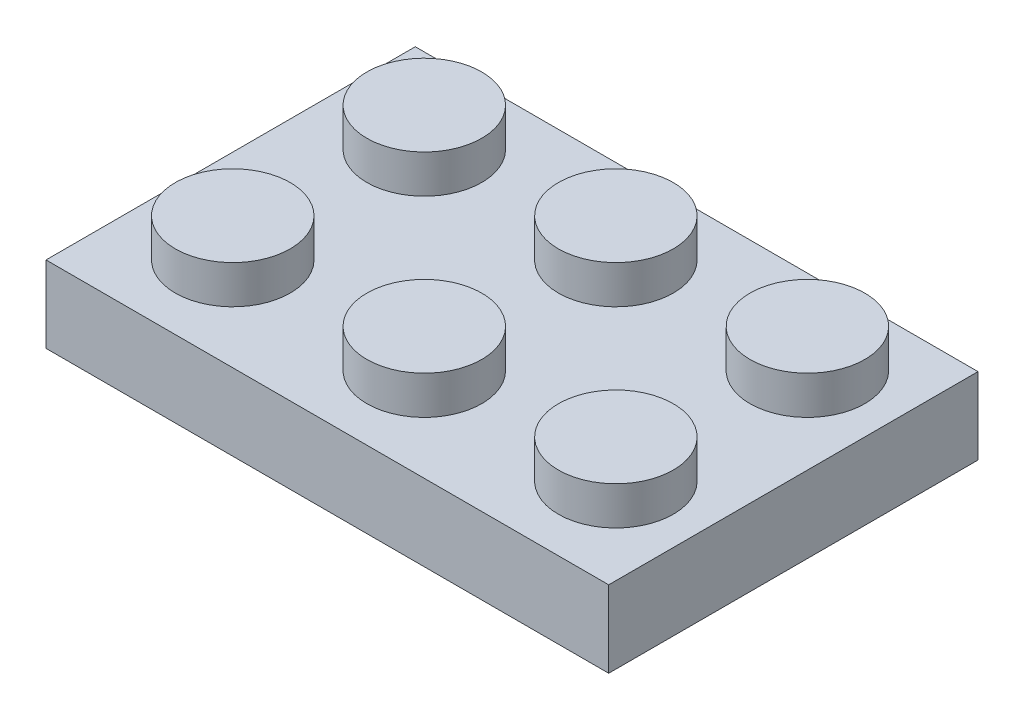
ISO-10303-21;
HEADER;
FILE_DESCRIPTION(('STEP AP214'),'2;1');
FILE_NAME('part.step','',(''),(''),'','','');
FILE_SCHEMA(('AUTOMOTIVE_DESIGN { 1 0 10303 214 1 1 1 1 }'));
ENDSEC;
DATA;
#1=APPLICATION_CONTEXT('core data for automotive mechanical design processes');
#2=APPLICATION_PROTOCOL_DEFINITION('international standard','automotive_design',2000,#1);
#3=PRODUCT_CONTEXT('',#1,'mechanical');
#4=PRODUCT('Part','Part','',(#3));
#5=PRODUCT_RELATED_PRODUCT_CATEGORY('part','',(#4));
#6=PRODUCT_DEFINITION_FORMATION('','',#4);
#7=PRODUCT_DEFINITION_CONTEXT('part definition',#1,'design');
#8=PRODUCT_DEFINITION('design','',#6,#7);
#9=PRODUCT_DEFINITION_SHAPE('','',#8);
#10=(LENGTH_UNIT() NAMED_UNIT(*) SI_UNIT(.MILLI.,.METRE.));
#11=(NAMED_UNIT(*) PLANE_ANGLE_UNIT() SI_UNIT($,.RADIAN.));
#12=(NAMED_UNIT(*) SI_UNIT($,.STERADIAN.) SOLID_ANGLE_UNIT());
#13=UNCERTAINTY_MEASURE_WITH_UNIT(LENGTH_MEASURE(1.E-05),#10,'distance_accuracy_value','');
#14=(GEOMETRIC_REPRESENTATION_CONTEXT(3) GLOBAL_UNCERTAINTY_ASSIGNED_CONTEXT((#13)) GLOBAL_UNIT_ASSIGNED_CONTEXT((#10,
#11,#12)) REPRESENTATION_CONTEXT('',''));
#15=CARTESIAN_POINT('',(0.,0.,0.));
#16=DIRECTION('',(0.,0.,1.));
#17=DIRECTION('',(1.,0.,0.));
#18=AXIS2_PLACEMENT_3D('',#15,#16,#17);
#19=CARTESIAN_POINT('',(0.,0.,-15.4232381672055));
#20=DIRECTION('',(0.,-1.,0.));
#21=DIRECTION('',(0.,0.,-1.));
#22=AXIS2_PLACEMENT_3D('',#19,#20,#21);
#23=PLANE('',#22);
#24=DIRECTION('',(1.,0.,0.));
#25=VECTOR('',#24,1.);
#26=CARTESIAN_POINT('',(0.,0.,0.));
#27=LINE('',#26,#25);
#28=CARTESIAN_POINT('',(0.,0.,0.));
#29=VERTEX_POINT('',#28);
#30=CARTESIAN_POINT('',(23.5016946042208,0.,0.));
#31=VERTEX_POINT('',#30);
#32=EDGE_CURVE('E206',#29,#31,#27,.T.);
#33=ORIENTED_EDGE('',*,*,#32,.F.);
#34=DIRECTION('',(0.,0.,1.));
#35=VECTOR('',#34,1.);
#36=CARTESIAN_POINT('',(0.,0.,-15.4232381672055));
#37=LINE('',#36,#35);
#38=CARTESIAN_POINT('',(0.,0.,-15.4232381672055));
#39=VERTEX_POINT('',#38);
#40=EDGE_CURVE('E89',#39,#29,#37,.T.);
#41=ORIENTED_EDGE('',*,*,#40,.F.);
#42=DIRECTION('',(1.,0.,0.));
#43=VECTOR('',#42,1.);
#44=CARTESIAN_POINT('',(0.,0.,-15.4232381672055));
#45=LINE('',#44,#43);
#46=CARTESIAN_POINT('',(23.5016946042208,0.,-15.4232381672055));
#47=VERTEX_POINT('',#46);
#48=EDGE_CURVE('E196',#39,#47,#45,.T.);
#49=ORIENTED_EDGE('',*,*,#48,.T.);
#50=DIRECTION('',(0.,0.,1.));
#51=VECTOR('',#50,1.);
#52=CARTESIAN_POINT('',(23.5016946042208,0.,-15.4232381672055));
#53=LINE('',#52,#51);
#54=EDGE_CURVE('E218',#47,#31,#53,.T.);
#55=ORIENTED_EDGE('',*,*,#54,.T.);
#56=EDGE_LOOP('',(#33,#41,#49,#55));
#57=FACE_BOUND('',#56,.T.);
#58=DIRECTION('',(0.,0.,1.));
#59=VECTOR('',#58,1.);
#60=CARTESIAN_POINT('',(1.2,0.,-15.4232381672055));
#61=LINE('',#60,#59);
#62=CARTESIAN_POINT('',(1.2,0.,-14.2232381672055));
#63=VERTEX_POINT('',#62);
#64=CARTESIAN_POINT('',(1.2,0.,-1.2));
#65=VERTEX_POINT('',#64);
#66=EDGE_CURVE('E134',#63,#65,#61,.T.);
#67=ORIENTED_EDGE('',*,*,#66,.T.);
#68=DIRECTION('',(1.,0.,0.));
#69=VECTOR('',#68,1.);
#70=CARTESIAN_POINT('',(0.,0.,-1.2));
#71=LINE('',#70,#69);
#72=CARTESIAN_POINT('',(22.3016946042208,0.,-1.2));
#73=VERTEX_POINT('',#72);
#74=EDGE_CURVE('E163',#65,#73,#71,.T.);
#75=ORIENTED_EDGE('',*,*,#74,.T.);
#76=DIRECTION('',(0.,0.,1.));
#77=VECTOR('',#76,1.);
#78=CARTESIAN_POINT('',(22.3016946042208,0.,-15.4232381672055));
#79=LINE('',#78,#77);
#80=CARTESIAN_POINT('',(22.3016946042208,0.,-14.2232381672055));
#81=VERTEX_POINT('',#80);
#82=EDGE_CURVE('E125',#81,#73,#79,.T.);
#83=ORIENTED_EDGE('',*,*,#82,.F.);
#84=DIRECTION('',(1.,0.,0.));
#85=VECTOR('',#84,1.);
#86=CARTESIAN_POINT('',(0.,0.,-14.2232381672055));
#87=LINE('',#86,#85);
#88=EDGE_CURVE('E54',#63,#81,#87,.T.);
#89=ORIENTED_EDGE('',*,*,#88,.F.);
#90=EDGE_LOOP('',(#67,#75,#83,#89));
#91=FACE_BOUND('',#90,.T.);
#92=ADVANCED_FACE('F39',(#57,#91),#23,.T.);
#93=CARTESIAN_POINT('',(19.9,4.8,-11.9));
#94=DIRECTION('',(0.,1.,0.));
#95=DIRECTION('',(0.,0.,1.));
#96=AXIS2_PLACEMENT_3D('',#93,#94,#95);
#97=PLANE('',#96);
#98=CARTESIAN_POINT('',(19.9,4.8,-11.9));
#99=DIRECTION('',(0.,1.,0.));
#100=DIRECTION('',(0.,0.,1.));
#101=AXIS2_PLACEMENT_3D('',#98,#99,#100);
#102=CIRCLE('',#101,2.4);
#103=CARTESIAN_POINT('',(19.9,4.8,-9.5));
#104=VERTEX_POINT('',#103);
#105=EDGE_CURVE('E241',#104,#104,#102,.T.);
#106=ORIENTED_EDGE('',*,*,#105,.T.);
#107=EDGE_LOOP('',(#106));
#108=FACE_BOUND('',#107,.T.);
#109=ADVANCED_FACE('F41',(#108),#97,.T.);
#110=CARTESIAN_POINT('',(19.9,4.8,-11.9));
#111=DIRECTION('',(0.,-1.,0.));
#112=DIRECTION('',(0.,0.,-1.));
#113=AXIS2_PLACEMENT_3D('',#110,#111,#112);
#114=CYLINDRICAL_SURFACE('',#113,2.4);
#115=ORIENTED_EDGE('',*,*,#105,.F.);
#116=EDGE_LOOP('',(#115));
#117=FACE_BOUND('',#116,.T.);
#118=CARTESIAN_POINT('',(19.9,3.2,-11.9));
#119=DIRECTION('',(0.,1.,0.));
#120=DIRECTION('',(0.,0.,1.));
#121=AXIS2_PLACEMENT_3D('',#118,#119,#120);
#122=CIRCLE('',#121,2.4);
#123=CARTESIAN_POINT('',(19.9,3.2,-9.5));
#124=VERTEX_POINT('',#123);
#125=EDGE_CURVE('E238',#124,#124,#122,.T.);
#126=ORIENTED_EDGE('',*,*,#125,.T.);
#127=EDGE_LOOP('',(#126));
#128=FACE_BOUND('',#127,.T.);
#129=ADVANCED_FACE('F275',(#117,#128),#114,.T.);
#130=CARTESIAN_POINT('',(19.9,4.8,-3.9));
#131=DIRECTION('',(0.,1.,0.));
#132=DIRECTION('',(0.,0.,1.));
#133=AXIS2_PLACEMENT_3D('',#130,#131,#132);
#134=PLANE('',#133);
#135=CARTESIAN_POINT('',(19.9,4.8,-3.9));
#136=DIRECTION('',(0.,1.,0.));
#137=DIRECTION('',(0.,0.,1.));
#138=AXIS2_PLACEMENT_3D('',#135,#136,#137);
#139=CIRCLE('',#138,2.4);
#140=CARTESIAN_POINT('',(19.9,4.8,-1.5));
#141=VERTEX_POINT('',#140);
#142=EDGE_CURVE('E235',#141,#141,#139,.T.);
#143=ORIENTED_EDGE('',*,*,#142,.T.);
#144=EDGE_LOOP('',(#143));
#145=FACE_BOUND('',#144,.T.);
#146=ADVANCED_FACE('F304',(#145),#134,.T.);
#147=CARTESIAN_POINT('',(19.9,4.8,-3.9));
#148=DIRECTION('',(0.,-1.,0.));
#149=DIRECTION('',(0.,0.,-1.));
#150=AXIS2_PLACEMENT_3D('',#147,#148,#149);
#151=CYLINDRICAL_SURFACE('',#150,2.4);
#152=ORIENTED_EDGE('',*,*,#142,.F.);
#153=EDGE_LOOP('',(#152));
#154=FACE_BOUND('',#153,.T.);
#155=CARTESIAN_POINT('',(19.9,3.2,-3.9));
#156=DIRECTION('',(0.,1.,0.));
#157=DIRECTION('',(0.,0.,1.));
#158=AXIS2_PLACEMENT_3D('',#155,#156,#157);
#159=CIRCLE('',#158,2.4);
#160=CARTESIAN_POINT('',(19.9,3.2,-1.5));
#161=VERTEX_POINT('',#160);
#162=EDGE_CURVE('E232',#161,#161,#159,.T.);
#163=ORIENTED_EDGE('',*,*,#162,.T.);
#164=EDGE_LOOP('',(#163));
#165=FACE_BOUND('',#164,.T.);
#166=ADVANCED_FACE('F300',(#154,#165),#151,.T.);
#167=CARTESIAN_POINT('',(11.9,4.8,-11.9));
#168=DIRECTION('',(0.,1.,0.));
#169=DIRECTION('',(0.,0.,1.));
#170=AXIS2_PLACEMENT_3D('',#167,#168,#169);
#171=PLANE('',#170);
#172=CARTESIAN_POINT('',(11.9,4.8,-11.9));
#173=DIRECTION('',(0.,1.,0.));
#174=DIRECTION('',(0.,0.,1.));
#175=AXIS2_PLACEMENT_3D('',#172,#173,#174);
#176=CIRCLE('',#175,2.4);
#177=CARTESIAN_POINT('',(11.9,4.8,-9.5));
#178=VERTEX_POINT('',#177);
#179=EDGE_CURVE('E229',#178,#178,#176,.T.);
#180=ORIENTED_EDGE('',*,*,#179,.T.);
#181=EDGE_LOOP('',(#180));
#182=FACE_BOUND('',#181,.T.);
#183=ADVANCED_FACE('F296',(#182),#171,.T.);
#184=CARTESIAN_POINT('',(11.9,4.8,-11.9));
#185=DIRECTION('',(0.,-1.,0.));
#186=DIRECTION('',(0.,0.,-1.));
#187=AXIS2_PLACEMENT_3D('',#184,#185,#186);
#188=CYLINDRICAL_SURFACE('',#187,2.4);
#189=ORIENTED_EDGE('',*,*,#179,.F.);
#190=EDGE_LOOP('',(#189));
#191=FACE_BOUND('',#190,.T.);
#192=CARTESIAN_POINT('',(11.9,3.2,-11.9));
#193=DIRECTION('',(0.,1.,0.));
#194=DIRECTION('',(0.,0.,1.));
#195=AXIS2_PLACEMENT_3D('',#192,#193,#194);
#196=CIRCLE('',#195,2.4);
#197=CARTESIAN_POINT('',(11.9,3.2,-9.5));
#198=VERTEX_POINT('',#197);
#199=EDGE_CURVE('E226',#198,#198,#196,.T.);
#200=ORIENTED_EDGE('',*,*,#199,.T.);
#201=EDGE_LOOP('',(#200));
#202=FACE_BOUND('',#201,.T.);
#203=ADVANCED_FACE('F292',(#191,#202),#188,.T.);
#204=CARTESIAN_POINT('',(11.9,4.8,-3.9));
#205=DIRECTION('',(0.,1.,0.));
#206=DIRECTION('',(0.,0.,1.));
#207=AXIS2_PLACEMENT_3D('',#204,#205,#206);
#208=PLANE('',#207);
#209=CARTESIAN_POINT('',(11.9,4.8,-3.9));
#210=DIRECTION('',(0.,1.,0.));
#211=DIRECTION('',(0.,0.,1.));
#212=AXIS2_PLACEMENT_3D('',#209,#210,#211);
#213=CIRCLE('',#212,2.4);
#214=CARTESIAN_POINT('',(11.9,4.8,-1.5));
#215=VERTEX_POINT('',#214);
#216=EDGE_CURVE('E223',#215,#215,#213,.T.);
#217=ORIENTED_EDGE('',*,*,#216,.T.);
#218=EDGE_LOOP('',(#217));
#219=FACE_BOUND('',#218,.T.);
#220=ADVANCED_FACE('F288',(#219),#208,.T.);
#221=CARTESIAN_POINT('',(11.9,4.8,-3.9));
#222=DIRECTION('',(0.,-1.,0.));
#223=DIRECTION('',(0.,0.,-1.));
#224=AXIS2_PLACEMENT_3D('',#221,#222,#223);
#225=CYLINDRICAL_SURFACE('',#224,2.4);
#226=ORIENTED_EDGE('',*,*,#216,.F.);
#227=EDGE_LOOP('',(#226));
#228=FACE_BOUND('',#227,.T.);
#229=CARTESIAN_POINT('',(11.9,3.2,-3.9));
#230=DIRECTION('',(0.,1.,0.));
#231=DIRECTION('',(0.,0.,1.));
#232=AXIS2_PLACEMENT_3D('',#229,#230,#231);
#233=CIRCLE('',#232,2.4);
#234=CARTESIAN_POINT('',(11.9,3.2,-1.5));
#235=VERTEX_POINT('',#234);
#236=EDGE_CURVE('E215',#235,#235,#233,.T.);
#237=ORIENTED_EDGE('',*,*,#236,.T.);
#238=EDGE_LOOP('',(#237));
#239=FACE_BOUND('',#238,.T.);
#240=ADVANCED_FACE('F285',(#228,#239),#225,.T.);
#241=CARTESIAN_POINT('',(0.,0.,-15.4232381672055));
#242=DIRECTION('',(-1.,0.,0.));
#243=DIRECTION('',(0.,0.,1.));
#244=AXIS2_PLACEMENT_3D('',#241,#242,#243);
#245=PLANE('',#244);
#246=DIRECTION('',(0.,-1.,0.));
#247=VECTOR('',#246,1.);
#248=CARTESIAN_POINT('',(0.,0.,0.));
#249=LINE('',#248,#247);
#250=CARTESIAN_POINT('',(0.,3.2,0.));
#251=VERTEX_POINT('',#250);
#252=EDGE_CURVE('E191',#251,#29,#249,.T.);
#253=ORIENTED_EDGE('',*,*,#252,.F.);
#254=DIRECTION('',(0.,0.,1.));
#255=VECTOR('',#254,1.);
#256=CARTESIAN_POINT('',(0.,3.2,-15.4232381672055));
#257=LINE('',#256,#255);
#258=CARTESIAN_POINT('',(0.,3.2,-15.4232381672055));
#259=VERTEX_POINT('',#258);
#260=EDGE_CURVE('E63',#259,#251,#257,.T.);
#261=ORIENTED_EDGE('',*,*,#260,.F.);
#262=DIRECTION('',(0.,-1.,0.));
#263=VECTOR('',#262,1.);
#264=CARTESIAN_POINT('',(0.,0.,-15.4232381672055));
#265=LINE('',#264,#263);
#266=EDGE_CURVE('E194',#259,#39,#265,.T.);
#267=ORIENTED_EDGE('',*,*,#266,.T.);
#268=ORIENTED_EDGE('',*,*,#40,.T.);
#269=EDGE_LOOP('',(#253,#261,#267,#268));
#270=FACE_BOUND('',#269,.T.);
#271=ADVANCED_FACE('F281',(#270),#245,.T.);
#272=CARTESIAN_POINT('',(0.,3.2,-15.4232381672055));
#273=DIRECTION('',(0.,1.,0.));
#274=DIRECTION('',(0.,0.,1.));
#275=AXIS2_PLACEMENT_3D('',#272,#273,#274);
#276=PLANE('',#275);
#277=CARTESIAN_POINT('',(3.9,3.2,-11.9));
#278=DIRECTION('',(0.,1.,0.));
#279=DIRECTION('',(0.,0.,1.));
#280=AXIS2_PLACEMENT_3D('',#277,#278,#279);
#281=CIRCLE('',#280,2.4);
#282=CARTESIAN_POINT('',(3.9,3.2,-9.5));
#283=VERTEX_POINT('',#282);
#284=EDGE_CURVE('E180',#283,#283,#281,.T.);
#285=ORIENTED_EDGE('',*,*,#284,.F.);
#286=EDGE_LOOP('',(#285));
#287=FACE_BOUND('',#286,.T.);
#288=CARTESIAN_POINT('',(3.9,3.2,-3.9));
#289=DIRECTION('',(0.,1.,0.));
#290=DIRECTION('',(0.,0.,1.));
#291=AXIS2_PLACEMENT_3D('',#288,#289,#290);
#292=CIRCLE('',#291,2.4);
#293=CARTESIAN_POINT('',(3.9,3.2,-1.5));
#294=VERTEX_POINT('',#293);
#295=EDGE_CURVE('E187',#294,#294,#292,.T.);
#296=ORIENTED_EDGE('',*,*,#295,.F.);
#297=EDGE_LOOP('',(#296));
#298=FACE_BOUND('',#297,.T.);
#299=DIRECTION('',(-1.,0.,0.));
#300=VECTOR('',#299,1.);
#301=CARTESIAN_POINT('',(0.,3.2,0.));
#302=LINE('',#301,#300);
#303=CARTESIAN_POINT('',(23.5016946042208,3.2,0.));
#304=VERTEX_POINT('',#303);
#305=EDGE_CURVE('E197',#304,#251,#302,.T.);
#306=ORIENTED_EDGE('',*,*,#305,.F.);
#307=DIRECTION('',(0.,0.,1.));
#308=VECTOR('',#307,1.);
#309=CARTESIAN_POINT('',(23.5016946042208,3.2,-15.4232381672055));
#310=LINE('',#309,#308);
#311=CARTESIAN_POINT('',(23.5016946042208,3.2,-15.4232381672055));
#312=VERTEX_POINT('',#311);
#313=EDGE_CURVE('E216',#312,#304,#310,.T.);
#314=ORIENTED_EDGE('',*,*,#313,.F.);
#315=DIRECTION('',(-1.,0.,0.));
#316=VECTOR('',#315,1.);
#317=CARTESIAN_POINT('',(0.,3.2,-15.4232381672055));
#318=LINE('',#317,#316);
#319=EDGE_CURVE('E202',#312,#259,#318,.T.);
#320=ORIENTED_EDGE('',*,*,#319,.T.);
#321=ORIENTED_EDGE('',*,*,#260,.T.);
#322=EDGE_LOOP('',(#306,#314,#320,#321));
#323=FACE_BOUND('',#322,.T.);
#324=ORIENTED_EDGE('',*,*,#236,.F.);
#325=EDGE_LOOP('',(#324));
#326=FACE_BOUND('',#325,.T.);
#327=ORIENTED_EDGE('',*,*,#199,.F.);
#328=EDGE_LOOP('',(#327));
#329=FACE_BOUND('',#328,.T.);
#330=ORIENTED_EDGE('',*,*,#162,.F.);
#331=EDGE_LOOP('',(#330));
#332=FACE_BOUND('',#331,.T.);
#333=ORIENTED_EDGE('',*,*,#125,.F.);
#334=EDGE_LOOP('',(#333));
#335=FACE_BOUND('',#334,.T.);
#336=ADVANCED_FACE('F284',(#287,#298,#323,#326,#329,#332,#335),#276,.T.);
#337=CARTESIAN_POINT('',(23.5016946042208,0.,-15.4232381672055));
#338=DIRECTION('',(1.,0.,0.));
#339=DIRECTION('',(0.,0.,-1.));
#340=AXIS2_PLACEMENT_3D('',#337,#338,#339);
#341=PLANE('',#340);
#342=DIRECTION('',(0.,1.,0.));
#343=VECTOR('',#342,1.);
#344=CARTESIAN_POINT('',(23.5016946042208,0.,0.));
#345=LINE('',#344,#343);
#346=EDGE_CURVE('E209',#31,#304,#345,.T.);
#347=ORIENTED_EDGE('',*,*,#346,.F.);
#348=ORIENTED_EDGE('',*,*,#54,.F.);
#349=DIRECTION('',(0.,1.,0.));
#350=VECTOR('',#349,1.);
#351=CARTESIAN_POINT('',(23.5016946042208,0.,-15.4232381672055));
#352=LINE('',#351,#350);
#353=EDGE_CURVE('E199',#47,#312,#352,.T.);
#354=ORIENTED_EDGE('',*,*,#353,.T.);
#355=ORIENTED_EDGE('',*,*,#313,.T.);
#356=EDGE_LOOP('',(#347,#348,#354,#355));
#357=FACE_BOUND('',#356,.T.);
#358=ADVANCED_FACE('F279',(#357),#341,.T.);
#359=CARTESIAN_POINT('',(0.,0.,-15.4232381672055));
#360=DIRECTION('',(0.,0.,-1.));
#361=DIRECTION('',(-1.,0.,0.));
#362=AXIS2_PLACEMENT_3D('',#359,#360,#361);
#363=PLANE('',#362);
#364=ORIENTED_EDGE('',*,*,#266,.F.);
#365=ORIENTED_EDGE('',*,*,#319,.F.);
#366=ORIENTED_EDGE('',*,*,#353,.F.);
#367=ORIENTED_EDGE('',*,*,#48,.F.);
#368=EDGE_LOOP('',(#364,#365,#366,#367));
#369=FACE_BOUND('',#368,.T.);
#370=ADVANCED_FACE('F321',(#369),#363,.T.);
#371=CARTESIAN_POINT('',(0.,0.,0.));
#372=DIRECTION('',(0.,0.,-1.));
#373=DIRECTION('',(-1.,0.,0.));
#374=AXIS2_PLACEMENT_3D('',#371,#372,#373);
#375=PLANE('',#374);
#376=ORIENTED_EDGE('',*,*,#252,.T.);
#377=ORIENTED_EDGE('',*,*,#32,.T.);
#378=ORIENTED_EDGE('',*,*,#346,.T.);
#379=ORIENTED_EDGE('',*,*,#305,.T.);
#380=EDGE_LOOP('',(#376,#377,#378,#379));
#381=FACE_BOUND('',#380,.T.);
#382=ADVANCED_FACE('F326',(#381),#375,.F.);
#383=CARTESIAN_POINT('',(3.9,4.8,-3.9));
#384=DIRECTION('',(0.,-1.,0.));
#385=DIRECTION('',(0.,0.,-1.));
#386=AXIS2_PLACEMENT_3D('',#383,#384,#385);
#387=CYLINDRICAL_SURFACE('',#386,2.4);
#388=CARTESIAN_POINT('',(3.9,4.8,-3.9));
#389=DIRECTION('',(0.,1.,0.));
#390=DIRECTION('',(0.,0.,1.));
#391=AXIS2_PLACEMENT_3D('',#388,#389,#390);
#392=CIRCLE('',#391,2.4);
#393=CARTESIAN_POINT('',(3.9,4.8,-1.5));
#394=VERTEX_POINT('',#393);
#395=EDGE_CURVE('E188',#394,#394,#392,.T.);
#396=ORIENTED_EDGE('',*,*,#395,.F.);
#397=EDGE_LOOP('',(#396));
#398=FACE_BOUND('',#397,.T.);
#399=ORIENTED_EDGE('',*,*,#295,.T.);
#400=EDGE_LOOP('',(#399));
#401=FACE_BOUND('',#400,.T.);
#402=ADVANCED_FACE('F329',(#398,#401),#387,.T.);
#403=CARTESIAN_POINT('',(3.9,4.8,-3.9));
#404=DIRECTION('',(0.,1.,0.));
#405=DIRECTION('',(0.,0.,1.));
#406=AXIS2_PLACEMENT_3D('',#403,#404,#405);
#407=PLANE('',#406);
#408=ORIENTED_EDGE('',*,*,#395,.T.);
#409=EDGE_LOOP('',(#408));
#410=FACE_BOUND('',#409,.T.);
#411=ADVANCED_FACE('F336',(#410),#407,.T.);
#412=CARTESIAN_POINT('',(3.9,4.8,-11.9));
#413=DIRECTION('',(0.,-1.,0.));
#414=DIRECTION('',(0.,0.,-1.));
#415=AXIS2_PLACEMENT_3D('',#412,#413,#414);
#416=CYLINDRICAL_SURFACE('',#415,2.4);
#417=CARTESIAN_POINT('',(3.9,4.8,-11.9));
#418=DIRECTION('',(0.,1.,0.));
#419=DIRECTION('',(0.,0.,1.));
#420=AXIS2_PLACEMENT_3D('',#417,#418,#419);
#421=CIRCLE('',#420,2.4);
#422=CARTESIAN_POINT('',(3.9,4.8,-9.5));
#423=VERTEX_POINT('',#422);
#424=EDGE_CURVE('E183',#423,#423,#421,.T.);
#425=ORIENTED_EDGE('',*,*,#424,.F.);
#426=EDGE_LOOP('',(#425));
#427=FACE_BOUND('',#426,.T.);
#428=ORIENTED_EDGE('',*,*,#284,.T.);
#429=EDGE_LOOP('',(#428));
#430=FACE_BOUND('',#429,.T.);
#431=ADVANCED_FACE('F340',(#427,#430),#416,.T.);
#432=CARTESIAN_POINT('',(3.9,4.8,-11.9));
#433=DIRECTION('',(0.,1.,0.));
#434=DIRECTION('',(0.,0.,1.));
#435=AXIS2_PLACEMENT_3D('',#432,#433,#434);
#436=PLANE('',#435);
#437=ORIENTED_EDGE('',*,*,#424,.T.);
#438=EDGE_LOOP('',(#437));
#439=FACE_BOUND('',#438,.T.);
#440=ADVANCED_FACE('F344',(#439),#436,.T.);
#441=CARTESIAN_POINT('',(19.9,3.6,-11.9));
#442=DIRECTION('',(0.,1.,0.));
#443=DIRECTION('',(0.,0.,1.));
#444=AXIS2_PLACEMENT_3D('',#441,#442,#443);
#445=PLANE('',#444);
#446=CARTESIAN_POINT('',(19.9,3.6,-11.9));
#447=DIRECTION('',(0.,1.,0.));
#448=DIRECTION('',(0.,0.,1.));
#449=AXIS2_PLACEMENT_3D('',#446,#447,#448);
#450=CIRCLE('',#449,1.2);
#451=CARTESIAN_POINT('',(19.9,3.6,-10.7));
#452=VERTEX_POINT('',#451);
#453=EDGE_CURVE('E184',#452,#452,#450,.T.);
#454=ORIENTED_EDGE('',*,*,#453,.F.);
#455=EDGE_LOOP('',(#454));
#456=FACE_BOUND('',#455,.T.);
#457=ADVANCED_FACE('F348',(#456),#445,.F.);
#458=CARTESIAN_POINT('',(19.9,4.8,-11.9));
#459=DIRECTION('',(0.,-1.,0.));
#460=DIRECTION('',(0.,0.,-1.));
#461=AXIS2_PLACEMENT_3D('',#458,#459,#460);
#462=CYLINDRICAL_SURFACE('',#461,1.2);
#463=ORIENTED_EDGE('',*,*,#453,.T.);
#464=EDGE_LOOP('',(#463));
#465=FACE_BOUND('',#464,.T.);
#466=CARTESIAN_POINT('',(19.9,2.,-11.9));
#467=DIRECTION('',(0.,1.,0.));
#468=DIRECTION('',(0.,0.,1.));
#469=AXIS2_PLACEMENT_3D('',#466,#467,#468);
#470=CIRCLE('',#469,1.2);
#471=CARTESIAN_POINT('',(19.9,2.,-10.7));
#472=VERTEX_POINT('',#471);
#473=EDGE_CURVE('E155',#472,#472,#470,.T.);
#474=ORIENTED_EDGE('',*,*,#473,.F.);
#475=EDGE_LOOP('',(#474));
#476=FACE_BOUND('',#475,.T.);
#477=ADVANCED_FACE('F397',(#465,#476),#462,.F.);
#478=CARTESIAN_POINT('',(19.9,3.6,-3.9));
#479=DIRECTION('',(0.,1.,0.));
#480=DIRECTION('',(0.,0.,1.));
#481=AXIS2_PLACEMENT_3D('',#478,#479,#480);
#482=PLANE('',#481);
#483=CARTESIAN_POINT('',(19.9,3.6,-3.9));
#484=DIRECTION('',(0.,1.,0.));
#485=DIRECTION('',(0.,0.,1.));
#486=AXIS2_PLACEMENT_3D('',#483,#484,#485);
#487=CIRCLE('',#486,1.2);
#488=CARTESIAN_POINT('',(19.9,3.6,-2.7));
#489=VERTEX_POINT('',#488);
#490=EDGE_CURVE('E152',#489,#489,#487,.T.);
#491=ORIENTED_EDGE('',*,*,#490,.F.);
#492=EDGE_LOOP('',(#491));
#493=FACE_BOUND('',#492,.T.);
#494=ADVANCED_FACE('F393',(#493),#482,.F.);
#495=CARTESIAN_POINT('',(19.9,4.8,-3.9));
#496=DIRECTION('',(0.,-1.,0.));
#497=DIRECTION('',(0.,0.,-1.));
#498=AXIS2_PLACEMENT_3D('',#495,#496,#497);
#499=CYLINDRICAL_SURFACE('',#498,1.2);
#500=ORIENTED_EDGE('',*,*,#490,.T.);
#501=EDGE_LOOP('',(#500));
#502=FACE_BOUND('',#501,.T.);
#503=CARTESIAN_POINT('',(19.9,2.,-3.9));
#504=DIRECTION('',(0.,1.,0.));
#505=DIRECTION('',(0.,0.,1.));
#506=AXIS2_PLACEMENT_3D('',#503,#504,#505);
#507=CIRCLE('',#506,1.2);
#508=CARTESIAN_POINT('',(19.9,2.,-2.7));
#509=VERTEX_POINT('',#508);
#510=EDGE_CURVE('E149',#509,#509,#507,.T.);
#511=ORIENTED_EDGE('',*,*,#510,.F.);
#512=EDGE_LOOP('',(#511));
#513=FACE_BOUND('',#512,.T.);
#514=ADVANCED_FACE('F389',(#502,#513),#499,.F.);
#515=CARTESIAN_POINT('',(11.9,3.6,-11.9));
#516=DIRECTION('',(0.,1.,0.));
#517=DIRECTION('',(0.,0.,1.));
#518=AXIS2_PLACEMENT_3D('',#515,#516,#517);
#519=PLANE('',#518);
#520=CARTESIAN_POINT('',(11.9,3.6,-11.9));
#521=DIRECTION('',(0.,1.,0.));
#522=DIRECTION('',(0.,0.,1.));
#523=AXIS2_PLACEMENT_3D('',#520,#521,#522);
#524=CIRCLE('',#523,1.2);
#525=CARTESIAN_POINT('',(11.9,3.6,-10.7));
#526=VERTEX_POINT('',#525);
#527=EDGE_CURVE('E148',#526,#526,#524,.T.);
#528=ORIENTED_EDGE('',*,*,#527,.F.);
#529=EDGE_LOOP('',(#528));
#530=FACE_BOUND('',#529,.T.);
#531=ADVANCED_FACE('F385',(#530),#519,.F.);
#532=CARTESIAN_POINT('',(11.9,4.8,-11.9));
#533=DIRECTION('',(0.,-1.,0.));
#534=DIRECTION('',(0.,0.,-1.));
#535=AXIS2_PLACEMENT_3D('',#532,#533,#534);
#536=CYLINDRICAL_SURFACE('',#535,1.2);
#537=ORIENTED_EDGE('',*,*,#527,.T.);
#538=EDGE_LOOP('',(#537));
#539=FACE_BOUND('',#538,.T.);
#540=CARTESIAN_POINT('',(11.9,2.,-11.9));
#541=DIRECTION('',(0.,1.,0.));
#542=DIRECTION('',(0.,0.,1.));
#543=AXIS2_PLACEMENT_3D('',#540,#541,#542);
#544=CIRCLE('',#543,1.2);
#545=CARTESIAN_POINT('',(11.9,2.,-10.7));
#546=VERTEX_POINT('',#545);
#547=EDGE_CURVE('E145',#546,#546,#544,.T.);
#548=ORIENTED_EDGE('',*,*,#547,.F.);
#549=EDGE_LOOP('',(#548));
#550=FACE_BOUND('',#549,.T.);
#551=ADVANCED_FACE('F381',(#539,#550),#536,.F.);
#552=CARTESIAN_POINT('',(11.9,3.6,-3.9));
#553=DIRECTION('',(0.,1.,0.));
#554=DIRECTION('',(0.,0.,1.));
#555=AXIS2_PLACEMENT_3D('',#552,#553,#554);
#556=PLANE('',#555);
#557=CARTESIAN_POINT('',(11.9,3.6,-3.9));
#558=DIRECTION('',(0.,1.,0.));
#559=DIRECTION('',(0.,0.,1.));
#560=AXIS2_PLACEMENT_3D('',#557,#558,#559);
#561=CIRCLE('',#560,1.2);
#562=CARTESIAN_POINT('',(11.9,3.6,-2.7));
#563=VERTEX_POINT('',#562);
#564=EDGE_CURVE('E144',#563,#563,#561,.T.);
#565=ORIENTED_EDGE('',*,*,#564,.F.);
#566=EDGE_LOOP('',(#565));
#567=FACE_BOUND('',#566,.T.);
#568=ADVANCED_FACE('F377',(#567),#556,.F.);
#569=CARTESIAN_POINT('',(11.9,4.8,-3.9));
#570=DIRECTION('',(0.,-1.,0.));
#571=DIRECTION('',(0.,0.,-1.));
#572=AXIS2_PLACEMENT_3D('',#569,#570,#571);
#573=CYLINDRICAL_SURFACE('',#572,1.2);
#574=ORIENTED_EDGE('',*,*,#564,.T.);
#575=EDGE_LOOP('',(#574));
#576=FACE_BOUND('',#575,.T.);
#577=CARTESIAN_POINT('',(11.9,2.,-3.9));
#578=DIRECTION('',(0.,1.,0.));
#579=DIRECTION('',(0.,0.,1.));
#580=AXIS2_PLACEMENT_3D('',#577,#578,#579);
#581=CIRCLE('',#580,1.2);
#582=CARTESIAN_POINT('',(11.9,2.,-2.7));
#583=VERTEX_POINT('',#582);
#584=EDGE_CURVE('E141',#583,#583,#581,.T.);
#585=ORIENTED_EDGE('',*,*,#584,.F.);
#586=EDGE_LOOP('',(#585));
#587=FACE_BOUND('',#586,.T.);
#588=ADVANCED_FACE('F374',(#576,#587),#573,.F.);
#589=CARTESIAN_POINT('',(1.2,0.,-15.4232381672055));
#590=DIRECTION('',(-1.,0.,0.));
#591=DIRECTION('',(0.,0.,1.));
#592=AXIS2_PLACEMENT_3D('',#589,#590,#591);
#593=PLANE('',#592);
#594=DIRECTION('',(0.,-1.,0.));
#595=VECTOR('',#594,1.);
#596=CARTESIAN_POINT('',(1.2,0.,-1.2));
#597=LINE('',#596,#595);
#598=CARTESIAN_POINT('',(1.2,2.,-1.2));
#599=VERTEX_POINT('',#598);
#600=EDGE_CURVE('E160',#599,#65,#597,.T.);
#601=ORIENTED_EDGE('',*,*,#600,.T.);
#602=ORIENTED_EDGE('',*,*,#66,.F.);
#603=DIRECTION('',(0.,-1.,0.));
#604=VECTOR('',#603,1.);
#605=CARTESIAN_POINT('',(1.2,0.,-14.2232381672055));
#606=LINE('',#605,#604);
#607=CARTESIAN_POINT('',(1.2,2.,-14.2232381672055));
#608=VERTEX_POINT('',#607);
#609=EDGE_CURVE('E165',#608,#63,#606,.T.);
#610=ORIENTED_EDGE('',*,*,#609,.F.);
#611=DIRECTION('',(0.,0.,1.));
#612=VECTOR('',#611,1.);
#613=CARTESIAN_POINT('',(1.2,2.,-15.4232381672055));
#614=LINE('',#613,#612);
#615=EDGE_CURVE('E124',#608,#599,#614,.T.);
#616=ORIENTED_EDGE('',*,*,#615,.T.);
#617=EDGE_LOOP('',(#601,#602,#610,#616));
#618=FACE_BOUND('',#617,.T.);
#619=ADVANCED_FACE('F251',(#618),#593,.F.);
#620=CARTESIAN_POINT('',(0.,2.,-15.4232381672055));
#621=DIRECTION('',(0.,1.,0.));
#622=DIRECTION('',(0.,0.,1.));
#623=AXIS2_PLACEMENT_3D('',#620,#621,#622);
#624=PLANE('',#623);
#625=CARTESIAN_POINT('',(15.9,2.,-7.9));
#626=DIRECTION('',(0.,1.,0.));
#627=DIRECTION('',(0.,0.,1.));
#628=AXIS2_PLACEMENT_3D('',#625,#626,#627);
#629=CIRCLE('',#628,3.25);
#630=CARTESIAN_POINT('',(15.9,2.,-4.65));
#631=VERTEX_POINT('',#630);
#632=EDGE_CURVE('E12',#631,#631,#629,.F.);
#633=ORIENTED_EDGE('',*,*,#632,.F.);
#634=EDGE_LOOP('',(#633));
#635=FACE_BOUND('',#634,.T.);
#636=CARTESIAN_POINT('',(7.9,2.,-7.9));
#637=DIRECTION('',(0.,1.,0.));
#638=DIRECTION('',(0.,0.,1.));
#639=AXIS2_PLACEMENT_3D('',#636,#637,#638);
#640=CIRCLE('',#639,3.25);
#641=CARTESIAN_POINT('',(7.9,2.,-4.65));
#642=VERTEX_POINT('',#641);
#643=EDGE_CURVE('E47',#642,#642,#640,.F.);
#644=ORIENTED_EDGE('',*,*,#643,.F.);
#645=EDGE_LOOP('',(#644));
#646=FACE_BOUND('',#645,.T.);
#647=CARTESIAN_POINT('',(3.9,2.,-11.9));
#648=DIRECTION('',(0.,1.,0.));
#649=DIRECTION('',(0.,0.,1.));
#650=AXIS2_PLACEMENT_3D('',#647,#648,#649);
#651=CIRCLE('',#650,1.2);
#652=CARTESIAN_POINT('',(3.9,2.,-10.7));
#653=VERTEX_POINT('',#652);
#654=EDGE_CURVE('E174',#653,#653,#651,.T.);
#655=ORIENTED_EDGE('',*,*,#654,.T.);
#656=EDGE_LOOP('',(#655));
#657=FACE_BOUND('',#656,.T.);
#658=CARTESIAN_POINT('',(3.9,2.,-3.9));
#659=DIRECTION('',(0.,1.,0.));
#660=DIRECTION('',(0.,0.,1.));
#661=AXIS2_PLACEMENT_3D('',#658,#659,#660);
#662=CIRCLE('',#661,1.2);
#663=CARTESIAN_POINT('',(3.9,2.,-2.7));
#664=VERTEX_POINT('',#663);
#665=EDGE_CURVE('E171',#664,#664,#662,.T.);
#666=ORIENTED_EDGE('',*,*,#665,.T.);
#667=EDGE_LOOP('',(#666));
#668=FACE_BOUND('',#667,.T.);
#669=DIRECTION('',(-1.,0.,0.));
#670=VECTOR('',#669,1.);
#671=CARTESIAN_POINT('',(0.,2.,-1.2));
#672=LINE('',#671,#670);
#673=CARTESIAN_POINT('',(22.3016946042208,2.,-1.2));
#674=VERTEX_POINT('',#673);
#675=EDGE_CURVE('E166',#674,#599,#672,.T.);
#676=ORIENTED_EDGE('',*,*,#675,.T.);
#677=ORIENTED_EDGE('',*,*,#615,.F.);
#678=DIRECTION('',(-1.,0.,0.));
#679=VECTOR('',#678,1.);
#680=CARTESIAN_POINT('',(0.,2.,-14.2232381672055));
#681=LINE('',#680,#679);
#682=CARTESIAN_POINT('',(22.3016946042208,2.,-14.2232381672055));
#683=VERTEX_POINT('',#682);
#684=EDGE_CURVE('E129',#683,#608,#681,.T.);
#685=ORIENTED_EDGE('',*,*,#684,.F.);
#686=DIRECTION('',(0.,0.,1.));
#687=VECTOR('',#686,1.);
#688=CARTESIAN_POINT('',(22.3016946042208,2.,-15.4232381672055));
#689=LINE('',#688,#687);
#690=EDGE_CURVE('E114',#683,#674,#689,.T.);
#691=ORIENTED_EDGE('',*,*,#690,.T.);
#692=EDGE_LOOP('',(#676,#677,#685,#691));
#693=FACE_BOUND('',#692,.T.);
#694=ORIENTED_EDGE('',*,*,#584,.T.);
#695=EDGE_LOOP('',(#694));
#696=FACE_BOUND('',#695,.T.);
#697=ORIENTED_EDGE('',*,*,#547,.T.);
#698=EDGE_LOOP('',(#697));
#699=FACE_BOUND('',#698,.T.);
#700=ORIENTED_EDGE('',*,*,#510,.T.);
#701=EDGE_LOOP('',(#700));
#702=FACE_BOUND('',#701,.T.);
#703=ORIENTED_EDGE('',*,*,#473,.T.);
#704=EDGE_LOOP('',(#703));
#705=FACE_BOUND('',#704,.T.);
#706=ADVANCED_FACE('F131',(#635,#646,#657,#668,#693,#696,#699,#702,#705),#624,.F.);
#707=CARTESIAN_POINT('',(22.3016946042208,0.,-15.4232381672055));
#708=DIRECTION('',(1.,0.,0.));
#709=DIRECTION('',(0.,0.,-1.));
#710=AXIS2_PLACEMENT_3D('',#707,#708,#709);
#711=PLANE('',#710);
#712=DIRECTION('',(0.,1.,0.));
#713=VECTOR('',#712,1.);
#714=CARTESIAN_POINT('',(22.3016946042208,0.,-1.2));
#715=LINE('',#714,#713);
#716=EDGE_CURVE('E119',#73,#674,#715,.T.);
#717=ORIENTED_EDGE('',*,*,#716,.T.);
#718=ORIENTED_EDGE('',*,*,#690,.F.);
#719=DIRECTION('',(0.,1.,0.));
#720=VECTOR('',#719,1.);
#721=CARTESIAN_POINT('',(22.3016946042208,0.,-14.2232381672055));
#722=LINE('',#721,#720);
#723=EDGE_CURVE('E116',#81,#683,#722,.T.);
#724=ORIENTED_EDGE('',*,*,#723,.F.);
#725=ORIENTED_EDGE('',*,*,#82,.T.);
#726=EDGE_LOOP('',(#717,#718,#724,#725));
#727=FACE_BOUND('',#726,.T.);
#728=ADVANCED_FACE('F115',(#727),#711,.F.);
#729=CARTESIAN_POINT('',(0.,0.,-14.2232381672055));
#730=DIRECTION('',(0.,0.,-1.));
#731=DIRECTION('',(-1.,0.,0.));
#732=AXIS2_PLACEMENT_3D('',#729,#730,#731);
#733=PLANE('',#732);
#734=ORIENTED_EDGE('',*,*,#609,.T.);
#735=ORIENTED_EDGE('',*,*,#88,.T.);
#736=ORIENTED_EDGE('',*,*,#723,.T.);
#737=ORIENTED_EDGE('',*,*,#684,.T.);
#738=EDGE_LOOP('',(#734,#735,#736,#737));
#739=FACE_BOUND('',#738,.T.);
#740=ADVANCED_FACE('F128',(#739),#733,.F.);
#741=CARTESIAN_POINT('',(0.,0.,-1.2));
#742=DIRECTION('',(0.,0.,-1.));
#743=DIRECTION('',(-1.,0.,0.));
#744=AXIS2_PLACEMENT_3D('',#741,#742,#743);
#745=PLANE('',#744);
#746=ORIENTED_EDGE('',*,*,#600,.F.);
#747=ORIENTED_EDGE('',*,*,#675,.F.);
#748=ORIENTED_EDGE('',*,*,#716,.F.);
#749=ORIENTED_EDGE('',*,*,#74,.F.);
#750=EDGE_LOOP('',(#746,#747,#748,#749));
#751=FACE_BOUND('',#750,.T.);
#752=ADVANCED_FACE('F267',(#751),#745,.T.);
#753=CARTESIAN_POINT('',(3.9,4.8,-3.9));
#754=DIRECTION('',(0.,-1.,0.));
#755=DIRECTION('',(0.,0.,-1.));
#756=AXIS2_PLACEMENT_3D('',#753,#754,#755);
#757=CYLINDRICAL_SURFACE('',#756,1.2);
#758=CARTESIAN_POINT('',(3.9,3.6,-3.9));
#759=DIRECTION('',(0.,1.,0.));
#760=DIRECTION('',(0.,0.,1.));
#761=AXIS2_PLACEMENT_3D('',#758,#759,#760);
#762=CIRCLE('',#761,1.2);
#763=CARTESIAN_POINT('',(3.9,3.6,-2.7));
#764=VERTEX_POINT('',#763);
#765=EDGE_CURVE('E164',#764,#764,#762,.T.);
#766=ORIENTED_EDGE('',*,*,#765,.T.);
#767=EDGE_LOOP('',(#766));
#768=FACE_BOUND('',#767,.T.);
#769=ORIENTED_EDGE('',*,*,#665,.F.);
#770=EDGE_LOOP('',(#769));
#771=FACE_BOUND('',#770,.T.);
#772=ADVANCED_FACE('F361',(#768,#771),#757,.F.);
#773=CARTESIAN_POINT('',(3.9,3.6,-3.9));
#774=DIRECTION('',(0.,1.,0.));
#775=DIRECTION('',(0.,0.,1.));
#776=AXIS2_PLACEMENT_3D('',#773,#774,#775);
#777=PLANE('',#776);
#778=ORIENTED_EDGE('',*,*,#765,.F.);
#779=EDGE_LOOP('',(#778));
#780=FACE_BOUND('',#779,.T.);
#781=ADVANCED_FACE('F357',(#780),#777,.F.);
#782=CARTESIAN_POINT('',(3.9,4.8,-11.9));
#783=DIRECTION('',(0.,-1.,0.));
#784=DIRECTION('',(0.,0.,-1.));
#785=AXIS2_PLACEMENT_3D('',#782,#783,#784);
#786=CYLINDRICAL_SURFACE('',#785,1.2);
#787=CARTESIAN_POINT('',(3.9,3.6,-11.9));
#788=DIRECTION('',(0.,1.,0.));
#789=DIRECTION('',(0.,0.,1.));
#790=AXIS2_PLACEMENT_3D('',#787,#788,#789);
#791=CIRCLE('',#790,1.2);
#792=CARTESIAN_POINT('',(3.9,3.6,-10.7));
#793=VERTEX_POINT('',#792);
#794=EDGE_CURVE('E172',#793,#793,#791,.T.);
#795=ORIENTED_EDGE('',*,*,#794,.T.);
#796=EDGE_LOOP('',(#795));
#797=FACE_BOUND('',#796,.T.);
#798=ORIENTED_EDGE('',*,*,#654,.F.);
#799=EDGE_LOOP('',(#798));
#800=FACE_BOUND('',#799,.T.);
#801=ADVANCED_FACE('F353',(#797,#800),#786,.F.);
#802=CARTESIAN_POINT('',(3.9,3.6,-11.9));
#803=DIRECTION('',(0.,1.,0.));
#804=DIRECTION('',(0.,0.,1.));
#805=AXIS2_PLACEMENT_3D('',#802,#803,#804);
#806=PLANE('',#805);
#807=ORIENTED_EDGE('',*,*,#794,.F.);
#808=EDGE_LOOP('',(#807));
#809=FACE_BOUND('',#808,.T.);
#810=ADVANCED_FACE('F350',(#809),#806,.F.);
#811=CARTESIAN_POINT('',(7.9,-9.19238815542512,-7.9));
#812=DIRECTION('',(0.,1.,0.));
#813=DIRECTION('',(0.,0.,1.));
#814=AXIS2_PLACEMENT_3D('',#811,#812,#813);
#815=CYLINDRICAL_SURFACE('',#814,3.25);
#816=ORIENTED_EDGE('',*,*,#643,.T.);
#817=EDGE_LOOP('',(#816));
#818=FACE_BOUND('',#817,.T.);
#819=CARTESIAN_POINT('',(7.9,0.200000000000001,-7.9));
#820=DIRECTION('',(0.,-1.,0.));
#821=DIRECTION('',(0.,0.,-1.));
#822=AXIS2_PLACEMENT_3D('',#819,#820,#821);
#823=CIRCLE('',#822,3.25);
#824=CARTESIAN_POINT('',(7.9,0.200000000000001,-11.15));
#825=VERTEX_POINT('',#824);
#826=EDGE_CURVE('E448',#825,#825,#823,.T.);
#827=ORIENTED_EDGE('',*,*,#826,.F.);
#828=EDGE_LOOP('',(#827));
#829=FACE_BOUND('',#828,.T.);
#830=ADVANCED_FACE('F246',(#818,#829),#815,.T.);
#831=CARTESIAN_POINT('',(7.9,-9.19238815542512,-7.9));
#832=DIRECTION('',(0.,1.,0.));
#833=DIRECTION('',(0.,0.,1.));
#834=AXIS2_PLACEMENT_3D('',#831,#832,#833);
#835=CYLINDRICAL_SURFACE('',#834,2.4);
#836=CARTESIAN_POINT('',(7.9,2.,-7.9));
#837=DIRECTION('',(0.,-1.,0.));
#838=DIRECTION('',(0.,0.,-1.));
#839=AXIS2_PLACEMENT_3D('',#836,#837,#838);
#840=CIRCLE('',#839,2.4);
#841=CARTESIAN_POINT('',(7.9,2.,-10.3));
#842=VERTEX_POINT('',#841);
#843=EDGE_CURVE('E442',#842,#842,#840,.T.);
#844=ORIENTED_EDGE('',*,*,#843,.F.);
#845=EDGE_LOOP('',(#844));
#846=FACE_BOUND('',#845,.T.);
#847=CARTESIAN_POINT('',(7.9,0.200000000000001,-7.9));
#848=DIRECTION('',(0.,-1.,0.));
#849=DIRECTION('',(0.,0.,-1.));
#850=AXIS2_PLACEMENT_3D('',#847,#848,#849);
#851=CIRCLE('',#850,2.4);
#852=CARTESIAN_POINT('',(7.9,0.200000000000001,-10.3));
#853=VERTEX_POINT('',#852);
#854=EDGE_CURVE('E438',#853,#853,#851,.T.);
#855=ORIENTED_EDGE('',*,*,#854,.T.);
#856=EDGE_LOOP('',(#855));
#857=FACE_BOUND('',#856,.T.);
#858=ADVANCED_FACE('F407',(#846,#857),#835,.F.);
#859=CARTESIAN_POINT('',(0.,0.2,-15.4232381672055));
#860=DIRECTION('',(0.,-1.,0.));
#861=DIRECTION('',(0.,0.,-1.));
#862=AXIS2_PLACEMENT_3D('',#859,#860,#861);
#863=PLANE('',#862);
#864=ORIENTED_EDGE('',*,*,#854,.F.);
#865=EDGE_LOOP('',(#864));
#866=FACE_BOUND('',#865,.T.);
#867=ORIENTED_EDGE('',*,*,#826,.T.);
#868=EDGE_LOOP('',(#867));
#869=FACE_BOUND('',#868,.T.);
#870=ADVANCED_FACE('F410',(#866,#869),#863,.T.);
#871=ORIENTED_EDGE('',*,*,#843,.T.);
#872=EDGE_LOOP('',(#871));
#873=FACE_BOUND('',#872,.T.);
#874=ADVANCED_FACE('F255',(#873),#624,.F.);
#875=CARTESIAN_POINT('',(15.9,-9.19238815542512,-7.9));
#876=DIRECTION('',(0.,1.,0.));
#877=DIRECTION('',(0.,0.,1.));
#878=AXIS2_PLACEMENT_3D('',#875,#876,#877);
#879=CYLINDRICAL_SURFACE('',#878,3.25);
#880=ORIENTED_EDGE('',*,*,#632,.T.);
#881=EDGE_LOOP('',(#880));
#882=FACE_BOUND('',#881,.T.);
#883=CARTESIAN_POINT('',(15.9,0.200000000000001,-7.9));
#884=DIRECTION('',(0.,-1.,0.));
#885=DIRECTION('',(0.,0.,-1.));
#886=AXIS2_PLACEMENT_3D('',#883,#884,#885);
#887=CIRCLE('',#886,3.25);
#888=CARTESIAN_POINT('',(15.9,0.200000000000001,-11.15));
#889=VERTEX_POINT('',#888);
#890=EDGE_CURVE('E436',#889,#889,#887,.T.);
#891=ORIENTED_EDGE('',*,*,#890,.F.);
#892=EDGE_LOOP('',(#891));
#893=FACE_BOUND('',#892,.T.);
#894=ADVANCED_FACE('F415',(#882,#893),#879,.T.);
#895=CARTESIAN_POINT('',(15.9,-9.19238815542512,-7.9));
#896=DIRECTION('',(0.,1.,0.));
#897=DIRECTION('',(0.,0.,1.));
#898=AXIS2_PLACEMENT_3D('',#895,#896,#897);
#899=CYLINDRICAL_SURFACE('',#898,2.4);
#900=CARTESIAN_POINT('',(15.9,2.,-7.9));
#901=DIRECTION('',(0.,-1.,0.));
#902=DIRECTION('',(0.,0.,-1.));
#903=AXIS2_PLACEMENT_3D('',#900,#901,#902);
#904=CIRCLE('',#903,2.4);
#905=CARTESIAN_POINT('',(15.9,2.,-10.3));
#906=VERTEX_POINT('',#905);
#907=EDGE_CURVE('E439',#906,#906,#904,.T.);
#908=ORIENTED_EDGE('',*,*,#907,.F.);
#909=EDGE_LOOP('',(#908));
#910=FACE_BOUND('',#909,.T.);
#911=CARTESIAN_POINT('',(15.9,0.200000000000001,-7.9));
#912=DIRECTION('',(0.,-1.,0.));
#913=DIRECTION('',(0.,0.,-1.));
#914=AXIS2_PLACEMENT_3D('',#911,#912,#913);
#915=CIRCLE('',#914,2.4);
#916=CARTESIAN_POINT('',(15.9,0.200000000000001,-10.3));
#917=VERTEX_POINT('',#916);
#918=EDGE_CURVE('E433',#917,#917,#915,.T.);
#919=ORIENTED_EDGE('',*,*,#918,.T.);
#920=EDGE_LOOP('',(#919));
#921=FACE_BOUND('',#920,.T.);
#922=ADVANCED_FACE('F418',(#910,#921),#899,.F.);
#923=CARTESIAN_POINT('',(0.,0.2,-15.4232381672055));
#924=DIRECTION('',(0.,-1.,0.));
#925=DIRECTION('',(0.,0.,-1.));
#926=AXIS2_PLACEMENT_3D('',#923,#924,#925);
#927=PLANE('',#926);
#928=ORIENTED_EDGE('',*,*,#918,.F.);
#929=EDGE_LOOP('',(#928));
#930=FACE_BOUND('',#929,.T.);
#931=ORIENTED_EDGE('',*,*,#890,.T.);
#932=EDGE_LOOP('',(#931));
#933=FACE_BOUND('',#932,.T.);
#934=ADVANCED_FACE('F422',(#930,#933),#927,.T.);
#935=ORIENTED_EDGE('',*,*,#907,.T.);
#936=EDGE_LOOP('',(#935));
#937=FACE_BOUND('',#936,.T.);
#938=ADVANCED_FACE('F254',(#937),#624,.F.);
#939=CLOSED_SHELL('',(#92,#109,#129,#146,#166,#183,#203,#220,#240,#271,#336,#358,#370,#382,#402,
#411,#431,#440,#457,#477,#494,#514,#531,#551,#568,#588,#619,#706,#728,#740,#752,#772,#781,#801,
#810,#830,#858,#870,#874,#894,#922,#934,#938));
#940=MANIFOLD_SOLID_BREP('B2',#939);
#941=ADVANCED_BREP_SHAPE_REPRESENTATION('',(#18,#940),#14);
#942=SHAPE_DEFINITION_REPRESENTATION(#9,#941);
ENDSEC;
END-ISO-10303-21;
